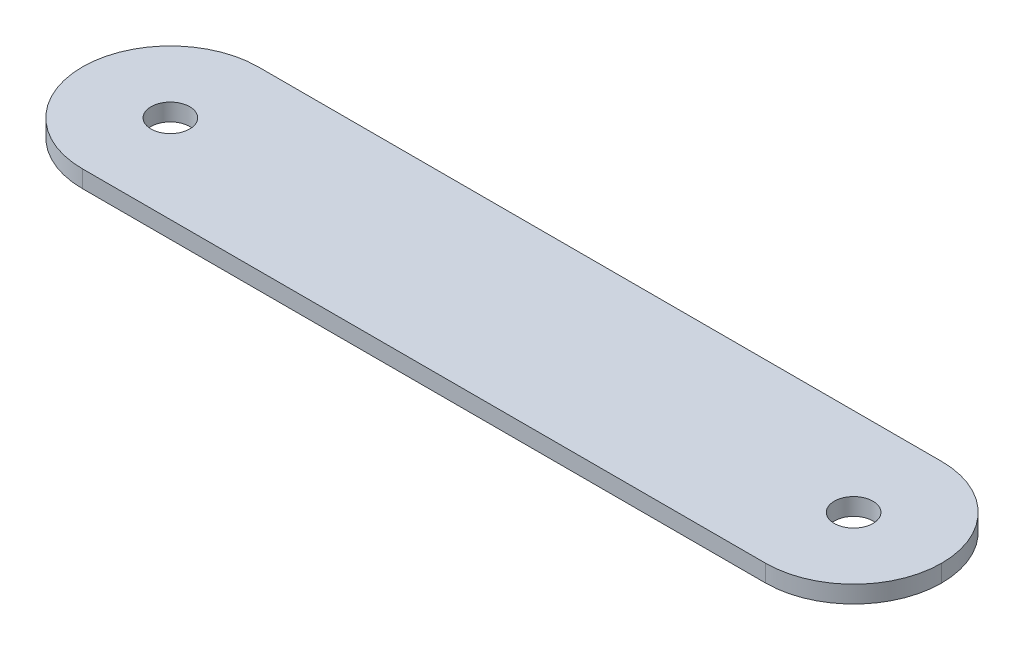
ISO-10303-21;
HEADER;
FILE_DESCRIPTION(('STEP AP214'),'2;1');
FILE_NAME('part.step','',(''),(''),'','','');
FILE_SCHEMA(('AUTOMOTIVE_DESIGN { 1 0 10303 214 1 1 1 1 }'));
ENDSEC;
DATA;
#1=APPLICATION_CONTEXT('core data for automotive mechanical design processes');
#2=APPLICATION_PROTOCOL_DEFINITION('international standard','automotive_design',2000,#1);
#3=PRODUCT_CONTEXT('',#1,'mechanical');
#4=PRODUCT('Part','Part','',(#3));
#5=PRODUCT_RELATED_PRODUCT_CATEGORY('part','',(#4));
#6=PRODUCT_DEFINITION_FORMATION('','',#4);
#7=PRODUCT_DEFINITION_CONTEXT('part definition',#1,'design');
#8=PRODUCT_DEFINITION('design','',#6,#7);
#9=PRODUCT_DEFINITION_SHAPE('','',#8);
#10=(LENGTH_UNIT() NAMED_UNIT(*) SI_UNIT(.MILLI.,.METRE.));
#11=(NAMED_UNIT(*) PLANE_ANGLE_UNIT() SI_UNIT($,.RADIAN.));
#12=(NAMED_UNIT(*) SI_UNIT($,.STERADIAN.) SOLID_ANGLE_UNIT());
#13=UNCERTAINTY_MEASURE_WITH_UNIT(LENGTH_MEASURE(1.E-05),#10,'distance_accuracy_value','');
#14=(GEOMETRIC_REPRESENTATION_CONTEXT(3) GLOBAL_UNCERTAINTY_ASSIGNED_CONTEXT((#13)) GLOBAL_UNIT_ASSIGNED_CONTEXT((#10,
#11,#12)) REPRESENTATION_CONTEXT('',''));
#15=CARTESIAN_POINT('',(0.,0.,0.));
#16=DIRECTION('',(0.,0.,1.));
#17=DIRECTION('',(1.,0.,0.));
#18=AXIS2_PLACEMENT_3D('',#15,#16,#17);
#19=CARTESIAN_POINT('',(0.,2.,0.));
#20=DIRECTION('',(0.,-1.,0.));
#21=DIRECTION('',(0.,0.,-1.));
#22=AXIS2_PLACEMENT_3D('',#19,#20,#21);
#23=PLANE('',#22);
#24=CARTESIAN_POINT('',(10.25,2.,-10.25));
#25=DIRECTION('',(0.,-1.,0.));
#26=DIRECTION('',(0.,0.,-1.));
#27=AXIS2_PLACEMENT_3D('',#24,#25,#26);
#28=CIRCLE('',#27,10.25);
#29=CARTESIAN_POINT('',(10.25,2.,-20.5));
#30=VERTEX_POINT('',#29);
#31=CARTESIAN_POINT('',(0.,2.,-10.25));
#32=VERTEX_POINT('',#31);
#33=EDGE_CURVE('E132',#30,#32,#28,.F.);
#34=ORIENTED_EDGE('',*,*,#33,.T.);
#35=CARTESIAN_POINT('',(10.25,2.,-10.25));
#36=DIRECTION('',(0.,-1.,0.));
#37=DIRECTION('',(0.,0.,-1.));
#38=AXIS2_PLACEMENT_3D('',#35,#36,#37);
#39=CIRCLE('',#38,10.25);
#40=CARTESIAN_POINT('',(10.25,2.,0.));
#41=VERTEX_POINT('',#40);
#42=EDGE_CURVE('E134',#32,#41,#39,.F.);
#43=ORIENTED_EDGE('',*,*,#42,.T.);
#44=DIRECTION('',(1.,0.,0.));
#45=VECTOR('',#44,1.);
#46=CARTESIAN_POINT('',(0.,2.,0.));
#47=LINE('',#46,#45);
#48=CARTESIAN_POINT('',(89.75,2.,0.));
#49=VERTEX_POINT('',#48);
#50=EDGE_CURVE('E107',#41,#49,#47,.T.);
#51=ORIENTED_EDGE('',*,*,#50,.T.);
#52=CARTESIAN_POINT('',(89.75,2.,-10.25));
#53=DIRECTION('',(0.,-1.,0.));
#54=DIRECTION('',(0.,0.,-1.));
#55=AXIS2_PLACEMENT_3D('',#52,#53,#54);
#56=CIRCLE('',#55,10.25);
#57=CARTESIAN_POINT('',(100.,2.,-10.25));
#58=VERTEX_POINT('',#57);
#59=EDGE_CURVE('E97',#49,#58,#56,.F.);
#60=ORIENTED_EDGE('',*,*,#59,.T.);
#61=CARTESIAN_POINT('',(89.75,2.,-10.25));
#62=DIRECTION('',(0.,-1.,0.));
#63=DIRECTION('',(0.,0.,-1.));
#64=AXIS2_PLACEMENT_3D('',#61,#62,#63);
#65=CIRCLE('',#64,10.25);
#66=CARTESIAN_POINT('',(89.75,2.,-20.5));
#67=VERTEX_POINT('',#66);
#68=EDGE_CURVE('E55',#58,#67,#65,.F.);
#69=ORIENTED_EDGE('',*,*,#68,.T.);
#70=DIRECTION('',(-1.,0.,0.));
#71=VECTOR('',#70,1.);
#72=CARTESIAN_POINT('',(0.,2.,-20.5));
#73=LINE('',#72,#71);
#74=EDGE_CURVE('E122',#67,#30,#73,.T.);
#75=ORIENTED_EDGE('',*,*,#74,.T.);
#76=EDGE_LOOP('',(#34,#43,#51,#60,#69,#75));
#77=FACE_BOUND('',#76,.T.);
#78=CARTESIAN_POINT('',(10.25,2.,-10.25));
#79=DIRECTION('',(0.,1.,0.));
#80=DIRECTION('',(0.,0.,1.));
#81=AXIS2_PLACEMENT_3D('',#78,#79,#80);
#82=CIRCLE('',#81,2.25);
#83=CARTESIAN_POINT('',(10.25,2.,-8.));
#84=VERTEX_POINT('',#83);
#85=EDGE_CURVE('E115',#84,#84,#82,.T.);
#86=ORIENTED_EDGE('',*,*,#85,.F.);
#87=EDGE_LOOP('',(#86));
#88=FACE_BOUND('',#87,.T.);
#89=CARTESIAN_POINT('',(89.75,2.,-10.25));
#90=DIRECTION('',(0.,1.,0.));
#91=DIRECTION('',(0.,0.,-1.));
#92=AXIS2_PLACEMENT_3D('',#89,#90,#91);
#93=CIRCLE('',#92,2.25);
#94=CARTESIAN_POINT('',(89.75,2.,-12.5));
#95=VERTEX_POINT('',#94);
#96=EDGE_CURVE('E139',#95,#95,#93,.T.);
#97=ORIENTED_EDGE('',*,*,#96,.F.);
#98=EDGE_LOOP('',(#97));
#99=FACE_BOUND('',#98,.T.);
#100=ADVANCED_FACE('F33',(#77,#88,#99),#23,.F.);
#101=CARTESIAN_POINT('',(0.,0.,0.));
#102=DIRECTION('',(0.,-1.,0.));
#103=DIRECTION('',(0.,0.,-1.));
#104=AXIS2_PLACEMENT_3D('',#101,#102,#103);
#105=PLANE('',#104);
#106=CARTESIAN_POINT('',(10.25,0.,-10.25));
#107=DIRECTION('',(0.,1.,0.));
#108=DIRECTION('',(0.,0.,1.));
#109=AXIS2_PLACEMENT_3D('',#106,#107,#108);
#110=CIRCLE('',#109,2.25);
#111=CARTESIAN_POINT('',(10.25,0.,-8.));
#112=VERTEX_POINT('',#111);
#113=EDGE_CURVE('E119',#112,#112,#110,.T.);
#114=ORIENTED_EDGE('',*,*,#113,.T.);
#115=EDGE_LOOP('',(#114));
#116=FACE_BOUND('',#115,.T.);
#117=DIRECTION('',(1.,0.,0.));
#118=VECTOR('',#117,1.);
#119=CARTESIAN_POINT('',(0.,0.,0.));
#120=LINE('',#119,#118);
#121=CARTESIAN_POINT('',(10.25,0.,0.));
#122=VERTEX_POINT('',#121);
#123=CARTESIAN_POINT('',(89.75,0.,0.));
#124=VERTEX_POINT('',#123);
#125=EDGE_CURVE('E104',#122,#124,#120,.T.);
#126=ORIENTED_EDGE('',*,*,#125,.F.);
#127=CARTESIAN_POINT('',(10.25,0.,-10.25));
#128=DIRECTION('',(0.,-1.,0.));
#129=DIRECTION('',(0.,0.,-1.));
#130=AXIS2_PLACEMENT_3D('',#127,#128,#129);
#131=CIRCLE('',#130,10.25);
#132=CARTESIAN_POINT('',(0.,0.,-10.25));
#133=VERTEX_POINT('',#132);
#134=EDGE_CURVE('E87',#122,#133,#131,.T.);
#135=ORIENTED_EDGE('',*,*,#134,.T.);
#136=CARTESIAN_POINT('',(10.25,0.,-10.25));
#137=DIRECTION('',(0.,-1.,0.));
#138=DIRECTION('',(0.,0.,-1.));
#139=AXIS2_PLACEMENT_3D('',#136,#137,#138);
#140=CIRCLE('',#139,10.25);
#141=CARTESIAN_POINT('',(10.25,0.,-20.5));
#142=VERTEX_POINT('',#141);
#143=EDGE_CURVE('E98',#133,#142,#140,.T.);
#144=ORIENTED_EDGE('',*,*,#143,.T.);
#145=DIRECTION('',(-1.,0.,0.));
#146=VECTOR('',#145,1.);
#147=CARTESIAN_POINT('',(0.,0.,-20.5));
#148=LINE('',#147,#146);
#149=CARTESIAN_POINT('',(89.75,0.,-20.5));
#150=VERTEX_POINT('',#149);
#151=EDGE_CURVE('E114',#150,#142,#148,.T.);
#152=ORIENTED_EDGE('',*,*,#151,.F.);
#153=CARTESIAN_POINT('',(89.75,0.,-10.25));
#154=DIRECTION('',(0.,-1.,0.));
#155=DIRECTION('',(0.,0.,-1.));
#156=AXIS2_PLACEMENT_3D('',#153,#154,#155);
#157=CIRCLE('',#156,10.25);
#158=CARTESIAN_POINT('',(100.,0.,-10.25));
#159=VERTEX_POINT('',#158);
#160=EDGE_CURVE('E127',#150,#159,#157,.T.);
#161=ORIENTED_EDGE('',*,*,#160,.T.);
#162=CARTESIAN_POINT('',(89.75,0.,-10.25));
#163=DIRECTION('',(0.,-1.,0.));
#164=DIRECTION('',(0.,0.,-1.));
#165=AXIS2_PLACEMENT_3D('',#162,#163,#164);
#166=CIRCLE('',#165,10.25);
#167=EDGE_CURVE('E108',#159,#124,#166,.T.);
#168=ORIENTED_EDGE('',*,*,#167,.T.);
#169=EDGE_LOOP('',(#126,#135,#144,#152,#161,#168));
#170=FACE_BOUND('',#169,.T.);
#171=CARTESIAN_POINT('',(89.75,0.,-10.25));
#172=DIRECTION('',(0.,1.,0.));
#173=DIRECTION('',(0.,0.,-1.));
#174=AXIS2_PLACEMENT_3D('',#171,#172,#173);
#175=CIRCLE('',#174,2.25);
#176=CARTESIAN_POINT('',(89.75,0.,-12.5));
#177=VERTEX_POINT('',#176);
#178=EDGE_CURVE('E137',#177,#177,#175,.T.);
#179=ORIENTED_EDGE('',*,*,#178,.T.);
#180=EDGE_LOOP('',(#179));
#181=FACE_BOUND('',#180,.T.);
#182=ADVANCED_FACE('F111',(#116,#170,#181),#105,.T.);
#183=CARTESIAN_POINT('',(0.,2.,0.));
#184=DIRECTION('',(0.,0.,-1.));
#185=DIRECTION('',(-1.,0.,0.));
#186=AXIS2_PLACEMENT_3D('',#183,#184,#185);
#187=PLANE('',#186);
#188=ORIENTED_EDGE('',*,*,#50,.F.);
#189=DIRECTION('',(0.,-1.,0.));
#190=VECTOR('',#189,1.);
#191=CARTESIAN_POINT('',(10.25,2.,0.));
#192=LINE('',#191,#190);
#193=EDGE_CURVE('E91',#41,#122,#192,.T.);
#194=ORIENTED_EDGE('',*,*,#193,.T.);
#195=ORIENTED_EDGE('',*,*,#125,.T.);
#196=DIRECTION('',(0.,-1.,0.));
#197=VECTOR('',#196,1.);
#198=CARTESIAN_POINT('',(89.75,2.,0.));
#199=LINE('',#198,#197);
#200=EDGE_CURVE('E109',#124,#49,#199,.F.);
#201=ORIENTED_EDGE('',*,*,#200,.T.);
#202=EDGE_LOOP('',(#188,#194,#195,#201));
#203=FACE_BOUND('',#202,.T.);
#204=ADVANCED_FACE('F103',(#203),#187,.F.);
#205=CARTESIAN_POINT('',(0.,2.,-20.5));
#206=DIRECTION('',(0.,0.,1.));
#207=DIRECTION('',(1.,0.,0.));
#208=AXIS2_PLACEMENT_3D('',#205,#206,#207);
#209=PLANE('',#208);
#210=ORIENTED_EDGE('',*,*,#151,.T.);
#211=DIRECTION('',(0.,-1.,0.));
#212=VECTOR('',#211,1.);
#213=CARTESIAN_POINT('',(10.25,2.,-20.5));
#214=LINE('',#213,#212);
#215=EDGE_CURVE('E11',#142,#30,#214,.F.);
#216=ORIENTED_EDGE('',*,*,#215,.T.);
#217=ORIENTED_EDGE('',*,*,#74,.F.);
#218=DIRECTION('',(0.,-1.,0.));
#219=VECTOR('',#218,1.);
#220=CARTESIAN_POINT('',(89.75,2.,-20.5));
#221=LINE('',#220,#219);
#222=EDGE_CURVE('E42',#67,#150,#221,.T.);
#223=ORIENTED_EDGE('',*,*,#222,.T.);
#224=EDGE_LOOP('',(#210,#216,#217,#223));
#225=FACE_BOUND('',#224,.T.);
#226=ADVANCED_FACE('F169',(#225),#209,.F.);
#227=CARTESIAN_POINT('',(10.25,2.,-10.25));
#228=DIRECTION('',(0.,-1.,0.));
#229=DIRECTION('',(0.,0.,-1.));
#230=AXIS2_PLACEMENT_3D('',#227,#228,#229);
#231=CYLINDRICAL_SURFACE('',#230,2.25);
#232=ORIENTED_EDGE('',*,*,#85,.T.);
#233=EDGE_LOOP('',(#232));
#234=FACE_BOUND('',#233,.T.);
#235=ORIENTED_EDGE('',*,*,#113,.F.);
#236=EDGE_LOOP('',(#235));
#237=FACE_BOUND('',#236,.T.);
#238=ADVANCED_FACE('F166',(#234,#237),#231,.F.);
#239=CARTESIAN_POINT('',(89.75,2.,-10.25));
#240=DIRECTION('',(0.,-1.,0.));
#241=DIRECTION('',(0.,0.,-1.));
#242=AXIS2_PLACEMENT_3D('',#239,#240,#241);
#243=CYLINDRICAL_SURFACE('',#242,2.25);
#244=ORIENTED_EDGE('',*,*,#96,.T.);
#245=EDGE_LOOP('',(#244));
#246=FACE_BOUND('',#245,.T.);
#247=ORIENTED_EDGE('',*,*,#178,.F.);
#248=EDGE_LOOP('',(#247));
#249=FACE_BOUND('',#248,.T.);
#250=ADVANCED_FACE('F155',(#246,#249),#243,.F.);
#251=CARTESIAN_POINT('',(10.25,2.,-10.25));
#252=DIRECTION('',(0.,-1.,0.));
#253=DIRECTION('',(0.,0.,-1.));
#254=AXIS2_PLACEMENT_3D('',#251,#252,#253);
#255=CYLINDRICAL_SURFACE('',#254,10.25);
#256=DIRECTION('',(0.,-1.,0.));
#257=VECTOR('',#256,1.);
#258=CARTESIAN_POINT('',(0.,2.,-10.25));
#259=LINE('',#258,#257);
#260=EDGE_CURVE('E93',#32,#133,#259,.T.);
#261=ORIENTED_EDGE('',*,*,#260,.F.);
#262=ORIENTED_EDGE('',*,*,#33,.F.);
#263=ORIENTED_EDGE('',*,*,#215,.F.);
#264=ORIENTED_EDGE('',*,*,#143,.F.);
#265=EDGE_LOOP('',(#261,#262,#263,#264));
#266=FACE_BOUND('',#265,.T.);
#267=ADVANCED_FACE('F176',(#266),#255,.T.);
#268=CARTESIAN_POINT('',(10.25,2.,-10.25));
#269=DIRECTION('',(0.,-1.,0.));
#270=DIRECTION('',(0.,0.,-1.));
#271=AXIS2_PLACEMENT_3D('',#268,#269,#270);
#272=CYLINDRICAL_SURFACE('',#271,10.25);
#273=ORIENTED_EDGE('',*,*,#42,.F.);
#274=ORIENTED_EDGE('',*,*,#260,.T.);
#275=ORIENTED_EDGE('',*,*,#134,.F.);
#276=ORIENTED_EDGE('',*,*,#193,.F.);
#277=EDGE_LOOP('',(#273,#274,#275,#276));
#278=FACE_BOUND('',#277,.T.);
#279=ADVANCED_FACE('F90',(#278),#272,.T.);
#280=CARTESIAN_POINT('',(89.75,2.,-10.25));
#281=DIRECTION('',(0.,-1.,0.));
#282=DIRECTION('',(0.,0.,-1.));
#283=AXIS2_PLACEMENT_3D('',#280,#281,#282);
#284=CYLINDRICAL_SURFACE('',#283,10.25);
#285=DIRECTION('',(0.,-1.,0.));
#286=VECTOR('',#285,1.);
#287=CARTESIAN_POINT('',(100.,2.,-10.25));
#288=LINE('',#287,#286);
#289=EDGE_CURVE('E37',#58,#159,#288,.T.);
#290=ORIENTED_EDGE('',*,*,#289,.F.);
#291=ORIENTED_EDGE('',*,*,#59,.F.);
#292=ORIENTED_EDGE('',*,*,#200,.F.);
#293=ORIENTED_EDGE('',*,*,#167,.F.);
#294=EDGE_LOOP('',(#290,#291,#292,#293));
#295=FACE_BOUND('',#294,.T.);
#296=ADVANCED_FACE('F35',(#295),#284,.T.);
#297=CARTESIAN_POINT('',(89.75,2.,-10.25));
#298=DIRECTION('',(0.,-1.,0.));
#299=DIRECTION('',(0.,0.,-1.));
#300=AXIS2_PLACEMENT_3D('',#297,#298,#299);
#301=CYLINDRICAL_SURFACE('',#300,10.25);
#302=ORIENTED_EDGE('',*,*,#68,.F.);
#303=ORIENTED_EDGE('',*,*,#289,.T.);
#304=ORIENTED_EDGE('',*,*,#160,.F.);
#305=ORIENTED_EDGE('',*,*,#222,.F.);
#306=EDGE_LOOP('',(#302,#303,#304,#305));
#307=FACE_BOUND('',#306,.T.);
#308=ADVANCED_FACE('F144',(#307),#301,.T.);
#309=CLOSED_SHELL('',(#100,#182,#204,#226,#238,#250,#267,#279,#296,#308));
#310=MANIFOLD_SOLID_BREP('B2',#309);
#311=ADVANCED_BREP_SHAPE_REPRESENTATION('',(#18,#310),#14);
#312=SHAPE_DEFINITION_REPRESENTATION(#9,#311);
ENDSEC;
END-ISO-10303-21;
